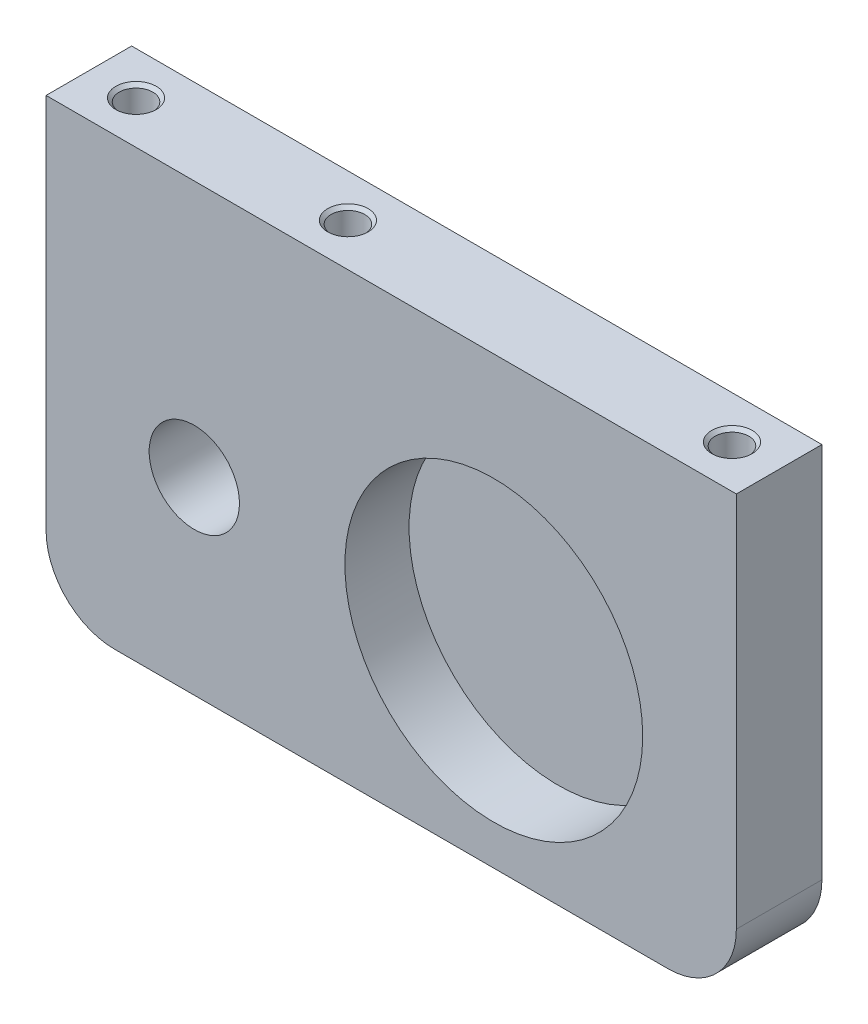
ISO-10303-21;
HEADER;
FILE_DESCRIPTION(('STEP AP214'),'2;1');
FILE_NAME('part.step','',(''),(''),'','','');
FILE_SCHEMA(('AUTOMOTIVE_DESIGN { 1 0 10303 214 1 1 1 1 }'));
ENDSEC;
DATA;
#1=APPLICATION_CONTEXT('core data for automotive mechanical design processes');
#2=APPLICATION_PROTOCOL_DEFINITION('international standard','automotive_design',2000,#1);
#3=PRODUCT_CONTEXT('',#1,'mechanical');
#4=PRODUCT('Part','Part','',(#3));
#5=PRODUCT_RELATED_PRODUCT_CATEGORY('part','',(#4));
#6=PRODUCT_DEFINITION_FORMATION('','',#4);
#7=PRODUCT_DEFINITION_CONTEXT('part definition',#1,'design');
#8=PRODUCT_DEFINITION('design','',#6,#7);
#9=PRODUCT_DEFINITION_SHAPE('','',#8);
#10=(LENGTH_UNIT() NAMED_UNIT(*) SI_UNIT(.MILLI.,.METRE.));
#11=(NAMED_UNIT(*) PLANE_ANGLE_UNIT() SI_UNIT($,.RADIAN.));
#12=(NAMED_UNIT(*) SI_UNIT($,.STERADIAN.) SOLID_ANGLE_UNIT());
#13=UNCERTAINTY_MEASURE_WITH_UNIT(LENGTH_MEASURE(1.E-05),#10,'distance_accuracy_value','');
#14=(GEOMETRIC_REPRESENTATION_CONTEXT(3) GLOBAL_UNCERTAINTY_ASSIGNED_CONTEXT((#13)) GLOBAL_UNIT_ASSIGNED_CONTEXT((#10,
#11,#12)) REPRESENTATION_CONTEXT('',''));
#15=CARTESIAN_POINT('',(0.,0.,0.));
#16=DIRECTION('',(0.,0.,1.));
#17=DIRECTION('',(1.,0.,0.));
#18=AXIS2_PLACEMENT_3D('',#15,#16,#17);
#19=CARTESIAN_POINT('',(-33.225,19.05,-6.35));
#20=DIRECTION('',(-1.,0.,0.));
#21=DIRECTION('',(0.,-1.,0.));
#22=AXIS2_PLACEMENT_3D('',#19,#20,#21);
#23=PLANE('',#22);
#24=DIRECTION('',(0.,-1.,0.));
#25=VECTOR('',#24,1.);
#26=CARTESIAN_POINT('',(-33.225,19.05,-6.35));
#27=LINE('',#26,#25);
#28=CARTESIAN_POINT('',(-33.225,19.05,-6.35));
#29=VERTEX_POINT('',#28);
#30=CARTESIAN_POINT('',(-33.225,-8.92,-6.35));
#31=VERTEX_POINT('',#30);
#32=EDGE_CURVE('E115',#29,#31,#27,.T.);
#33=ORIENTED_EDGE('',*,*,#32,.T.);
#34=DIRECTION('',(0.,0.,1.));
#35=VECTOR('',#34,1.);
#36=CARTESIAN_POINT('',(-33.225,-8.92,-6.35));
#37=LINE('',#36,#35);
#38=CARTESIAN_POINT('',(-33.225,-8.92,0.));
#39=VERTEX_POINT('',#38);
#40=EDGE_CURVE('E143',#31,#39,#37,.T.);
#41=ORIENTED_EDGE('',*,*,#40,.T.);
#42=DIRECTION('',(0.,-1.,0.));
#43=VECTOR('',#42,1.);
#44=CARTESIAN_POINT('',(-33.225,19.05,0.));
#45=LINE('',#44,#43);
#46=CARTESIAN_POINT('',(-33.225,19.05,0.));
#47=VERTEX_POINT('',#46);
#48=EDGE_CURVE('E119',#47,#39,#45,.T.);
#49=ORIENTED_EDGE('',*,*,#48,.F.);
#50=DIRECTION('',(0.,0.,1.));
#51=VECTOR('',#50,1.);
#52=CARTESIAN_POINT('',(-33.225,19.05,-6.35));
#53=LINE('',#52,#51);
#54=EDGE_CURVE('E112',#29,#47,#53,.T.);
#55=ORIENTED_EDGE('',*,*,#54,.F.);
#56=EDGE_LOOP('',(#33,#41,#49,#55));
#57=FACE_BOUND('',#56,.T.);
#58=ADVANCED_FACE('F42',(#57),#23,.T.);
#59=CARTESIAN_POINT('',(-33.225,19.05,-6.35));
#60=DIRECTION('',(0.,1.,0.));
#61=DIRECTION('',(0.,0.,1.));
#62=AXIS2_PLACEMENT_3D('',#59,#60,#61);
#63=PLANE('',#62);
#64=CARTESIAN_POINT('',(14.5000000000001,19.05,-3.175));
#65=DIRECTION('',(0.,1.,0.));
#66=DIRECTION('',(0.,0.,1.));
#67=AXIS2_PLACEMENT_3D('',#64,#65,#66);
#68=CIRCLE('',#67,1.49999999999981);
#69=CARTESIAN_POINT('',(14.5000000000001,19.05,-1.67500000000019));
#70=VERTEX_POINT('',#69);
#71=EDGE_CURVE('E157',#70,#70,#68,.F.);
#72=ORIENTED_EDGE('',*,*,#71,.T.);
#73=EDGE_LOOP('',(#72));
#74=FACE_BOUND('',#73,.T.);
#75=CARTESIAN_POINT('',(-14.,19.05,-3.175));
#76=DIRECTION('',(0.,1.,0.));
#77=DIRECTION('',(0.,0.,1.));
#78=AXIS2_PLACEMENT_3D('',#75,#76,#77);
#79=CIRCLE('',#78,1.49999999999922);
#80=CARTESIAN_POINT('',(-14.,19.05,-1.67500000000078));
#81=VERTEX_POINT('',#80);
#82=EDGE_CURVE('E153',#81,#81,#79,.F.);
#83=ORIENTED_EDGE('',*,*,#82,.T.);
#84=EDGE_LOOP('',(#83));
#85=FACE_BOUND('',#84,.T.);
#86=CARTESIAN_POINT('',(-29.725,19.05,-3.175));
#87=DIRECTION('',(0.,1.,0.));
#88=DIRECTION('',(0.,0.,1.));
#89=AXIS2_PLACEMENT_3D('',#86,#87,#88);
#90=CIRCLE('',#89,1.49999999999981);
#91=CARTESIAN_POINT('',(-29.725,19.05,-1.67500000000019));
#92=VERTEX_POINT('',#91);
#93=EDGE_CURVE('E149',#92,#92,#90,.F.);
#94=ORIENTED_EDGE('',*,*,#93,.T.);
#95=EDGE_LOOP('',(#94));
#96=FACE_BOUND('',#95,.T.);
#97=DIRECTION('',(-1.,0.,0.));
#98=VECTOR('',#97,1.);
#99=CARTESIAN_POINT('',(-33.225,19.05,0.));
#100=LINE('',#99,#98);
#101=CARTESIAN_POINT('',(18.,19.05,0.));
#102=VERTEX_POINT('',#101);
#103=EDGE_CURVE('E111',#102,#47,#100,.T.);
#104=ORIENTED_EDGE('',*,*,#103,.F.);
#105=DIRECTION('',(0.,0.,1.));
#106=VECTOR('',#105,1.);
#107=CARTESIAN_POINT('',(18.,19.05,-6.35));
#108=LINE('',#107,#106);
#109=CARTESIAN_POINT('',(18.,19.05,-6.35));
#110=VERTEX_POINT('',#109);
#111=EDGE_CURVE('E99',#110,#102,#108,.T.);
#112=ORIENTED_EDGE('',*,*,#111,.F.);
#113=DIRECTION('',(-1.,0.,0.));
#114=VECTOR('',#113,1.);
#115=CARTESIAN_POINT('',(-33.225,19.05,-6.35));
#116=LINE('',#115,#114);
#117=EDGE_CURVE('E104',#110,#29,#116,.T.);
#118=ORIENTED_EDGE('',*,*,#117,.T.);
#119=ORIENTED_EDGE('',*,*,#54,.T.);
#120=EDGE_LOOP('',(#104,#112,#118,#119));
#121=FACE_BOUND('',#120,.T.);
#122=ADVANCED_FACE('F109',(#74,#85,#96,#121),#63,.T.);
#123=CARTESIAN_POINT('',(18.,19.05,-6.35));
#124=DIRECTION('',(1.,0.,0.));
#125=DIRECTION('',(0.,1.,0.));
#126=AXIS2_PLACEMENT_3D('',#123,#124,#125);
#127=PLANE('',#126);
#128=DIRECTION('',(0.,1.,0.));
#129=VECTOR('',#128,1.);
#130=CARTESIAN_POINT('',(18.,19.05,0.));
#131=LINE('',#130,#129);
#132=CARTESIAN_POINT('',(18.,-8.92,0.));
#133=VERTEX_POINT('',#132);
#134=EDGE_CURVE('E126',#133,#102,#131,.T.);
#135=ORIENTED_EDGE('',*,*,#134,.F.);
#136=DIRECTION('',(0.,0.,1.));
#137=VECTOR('',#136,1.);
#138=CARTESIAN_POINT('',(18.,-8.92,-6.35));
#139=LINE('',#138,#137);
#140=CARTESIAN_POINT('',(18.,-8.92,-6.35));
#141=VERTEX_POINT('',#140);
#142=EDGE_CURVE('E65',#133,#141,#139,.F.);
#143=ORIENTED_EDGE('',*,*,#142,.T.);
#144=DIRECTION('',(0.,1.,0.));
#145=VECTOR('',#144,1.);
#146=CARTESIAN_POINT('',(18.,19.05,-6.35));
#147=LINE('',#146,#145);
#148=EDGE_CURVE('E96',#141,#110,#147,.T.);
#149=ORIENTED_EDGE('',*,*,#148,.T.);
#150=ORIENTED_EDGE('',*,*,#111,.T.);
#151=EDGE_LOOP('',(#135,#143,#149,#150));
#152=FACE_BOUND('',#151,.T.);
#153=ADVANCED_FACE('F98',(#152),#127,.T.);
#154=CARTESIAN_POINT('',(-33.225,-14.,-6.35));
#155=DIRECTION('',(0.,-1.,0.));
#156=DIRECTION('',(0.,0.,-1.));
#157=AXIS2_PLACEMENT_3D('',#154,#155,#156);
#158=PLANE('',#157);
#159=DIRECTION('',(1.,0.,0.));
#160=VECTOR('',#159,1.);
#161=CARTESIAN_POINT('',(-33.225,-14.,-6.35));
#162=LINE('',#161,#160);
#163=CARTESIAN_POINT('',(-28.145,-14.,-6.35));
#164=VERTEX_POINT('',#163);
#165=CARTESIAN_POINT('',(12.92,-14.,-6.35));
#166=VERTEX_POINT('',#165);
#167=EDGE_CURVE('E105',#164,#166,#162,.T.);
#168=ORIENTED_EDGE('',*,*,#167,.T.);
#169=DIRECTION('',(0.,0.,1.));
#170=VECTOR('',#169,1.);
#171=CARTESIAN_POINT('',(12.92,-14.,-6.35));
#172=LINE('',#171,#170);
#173=CARTESIAN_POINT('',(12.92,-14.,0.));
#174=VERTEX_POINT('',#173);
#175=EDGE_CURVE('E132',#166,#174,#172,.T.);
#176=ORIENTED_EDGE('',*,*,#175,.T.);
#177=DIRECTION('',(1.,0.,0.));
#178=VECTOR('',#177,1.);
#179=CARTESIAN_POINT('',(-33.225,-14.,0.));
#180=LINE('',#179,#178);
#181=CARTESIAN_POINT('',(-28.145,-14.,0.));
#182=VERTEX_POINT('',#181);
#183=EDGE_CURVE('E122',#182,#174,#180,.T.);
#184=ORIENTED_EDGE('',*,*,#183,.F.);
#185=DIRECTION('',(0.,0.,1.));
#186=VECTOR('',#185,1.);
#187=CARTESIAN_POINT('',(-28.145,-14.,-6.35));
#188=LINE('',#187,#186);
#189=EDGE_CURVE('E129',#182,#164,#188,.F.);
#190=ORIENTED_EDGE('',*,*,#189,.T.);
#191=EDGE_LOOP('',(#168,#176,#184,#190));
#192=FACE_BOUND('',#191,.T.);
#193=ADVANCED_FACE('F189',(#192),#158,.T.);
#194=CARTESIAN_POINT('',(0.,0.,-6.35));
#195=DIRECTION('',(0.,0.,1.));
#196=DIRECTION('',(1.,0.,0.));
#197=AXIS2_PLACEMENT_3D('',#194,#195,#196);
#198=PLANE('',#197);
#199=ORIENTED_EDGE('',*,*,#148,.F.);
#200=CARTESIAN_POINT('',(12.92,-8.92,-6.35));
#201=DIRECTION('',(0.,0.,1.));
#202=DIRECTION('',(1.,0.,0.));
#203=AXIS2_PLACEMENT_3D('',#200,#201,#202);
#204=CIRCLE('',#203,5.08);
#205=EDGE_CURVE('E141',#141,#166,#204,.F.);
#206=ORIENTED_EDGE('',*,*,#205,.T.);
#207=ORIENTED_EDGE('',*,*,#167,.F.);
#208=CARTESIAN_POINT('',(-28.145,-8.92,-6.35));
#209=DIRECTION('',(0.,0.,1.));
#210=DIRECTION('',(1.,0.,0.));
#211=AXIS2_PLACEMENT_3D('',#208,#209,#210);
#212=CIRCLE('',#211,5.08);
#213=EDGE_CURVE('E57',#164,#31,#212,.F.);
#214=ORIENTED_EDGE('',*,*,#213,.T.);
#215=ORIENTED_EDGE('',*,*,#32,.F.);
#216=ORIENTED_EDGE('',*,*,#117,.F.);
#217=EDGE_LOOP('',(#199,#206,#207,#214,#215,#216));
#218=FACE_BOUND('',#217,.T.);
#219=ADVANCED_FACE('F114',(#218),#198,.F.);
#220=CARTESIAN_POINT('',(0.,0.,0.));
#221=DIRECTION('',(0.,0.,1.));
#222=DIRECTION('',(1.,0.,0.));
#223=AXIS2_PLACEMENT_3D('',#220,#221,#222);
#224=PLANE('',#223);
#225=CARTESIAN_POINT('',(-22.225,0.,0.));
#226=DIRECTION('',(0.,0.,1.));
#227=DIRECTION('',(1.,0.,0.));
#228=AXIS2_PLACEMENT_3D('',#225,#226,#227);
#229=CIRCLE('',#228,3.35);
#230=CARTESIAN_POINT('',(-18.875,0.,0.));
#231=VERTEX_POINT('',#230);
#232=EDGE_CURVE('E224',#231,#231,#229,.T.);
#233=ORIENTED_EDGE('',*,*,#232,.F.);
#234=EDGE_LOOP('',(#233));
#235=FACE_BOUND('',#234,.T.);
#236=CARTESIAN_POINT('',(0.,0.,0.));
#237=DIRECTION('',(0.,0.,1.));
#238=DIRECTION('',(1.,0.,0.));
#239=AXIS2_PLACEMENT_3D('',#236,#237,#238);
#240=CIRCLE('',#239,11.05);
#241=CARTESIAN_POINT('',(11.05,0.,0.));
#242=VERTEX_POINT('',#241);
#243=EDGE_CURVE('E225',#242,#242,#240,.T.);
#244=ORIENTED_EDGE('',*,*,#243,.F.);
#245=EDGE_LOOP('',(#244));
#246=FACE_BOUND('',#245,.T.);
#247=ORIENTED_EDGE('',*,*,#183,.T.);
#248=CARTESIAN_POINT('',(12.92,-8.92,0.));
#249=DIRECTION('',(0.,0.,1.));
#250=DIRECTION('',(1.,0.,0.));
#251=AXIS2_PLACEMENT_3D('',#248,#249,#250);
#252=CIRCLE('',#251,5.08);
#253=EDGE_CURVE('E137',#174,#133,#252,.T.);
#254=ORIENTED_EDGE('',*,*,#253,.T.);
#255=ORIENTED_EDGE('',*,*,#134,.T.);
#256=ORIENTED_EDGE('',*,*,#103,.T.);
#257=ORIENTED_EDGE('',*,*,#48,.T.);
#258=CARTESIAN_POINT('',(-28.145,-8.92,0.));
#259=DIRECTION('',(0.,0.,1.));
#260=DIRECTION('',(1.,0.,0.));
#261=AXIS2_PLACEMENT_3D('',#258,#259,#260);
#262=CIRCLE('',#261,5.08);
#263=EDGE_CURVE('E135',#39,#182,#262,.T.);
#264=ORIENTED_EDGE('',*,*,#263,.T.);
#265=EDGE_LOOP('',(#247,#254,#255,#256,#257,#264));
#266=FACE_BOUND('',#265,.T.);
#267=ADVANCED_FACE('F204',(#235,#246,#266),#224,.T.);
#268=CARTESIAN_POINT('',(14.5000000000001,4.05,-3.175));
#269=DIRECTION('',(0.,1.,0.));
#270=DIRECTION('',(0.,0.,1.));
#271=AXIS2_PLACEMENT_3D('',#268,#269,#270);
#272=CYLINDRICAL_SURFACE('',#271,1.2499999999998);
#273=CARTESIAN_POINT('',(14.5000000000001,18.8,-3.175));
#274=DIRECTION('',(0.,1.,0.));
#275=DIRECTION('',(0.,0.,1.));
#276=AXIS2_PLACEMENT_3D('',#273,#274,#275);
#277=CIRCLE('',#276,1.2499999999998);
#278=CARTESIAN_POINT('',(14.5000000000001,18.8,-1.9250000000002));
#279=VERTEX_POINT('',#278);
#280=EDGE_CURVE('E146',#279,#279,#277,.T.);
#281=ORIENTED_EDGE('',*,*,#280,.T.);
#282=EDGE_LOOP('',(#281));
#283=FACE_BOUND('',#282,.T.);
#284=CARTESIAN_POINT('',(14.5000000000001,4.05,-3.175));
#285=DIRECTION('',(0.,1.,0.));
#286=DIRECTION('',(0.,0.,1.));
#287=AXIS2_PLACEMENT_3D('',#284,#285,#286);
#288=CIRCLE('',#287,1.2499999999998);
#289=CARTESIAN_POINT('',(14.5000000000001,4.05,-1.9250000000002));
#290=VERTEX_POINT('',#289);
#291=EDGE_CURVE('E211',#290,#290,#288,.T.);
#292=ORIENTED_EDGE('',*,*,#291,.F.);
#293=EDGE_LOOP('',(#292));
#294=FACE_BOUND('',#293,.T.);
#295=ADVANCED_FACE('F238',(#283,#294),#272,.F.);
#296=CARTESIAN_POINT('',(14.5000000000001,4.05,-3.175));
#297=DIRECTION('',(0.,1.,0.));
#298=DIRECTION('',(0.,0.,1.));
#299=AXIS2_PLACEMENT_3D('',#296,#297,#298);
#300=PLANE('',#299);
#301=ORIENTED_EDGE('',*,*,#291,.T.);
#302=EDGE_LOOP('',(#301));
#303=FACE_BOUND('',#302,.T.);
#304=ADVANCED_FACE('F268',(#303),#300,.T.);
#305=CARTESIAN_POINT('',(-14.,4.05,-3.175));
#306=DIRECTION('',(0.,1.,0.));
#307=DIRECTION('',(0.,0.,1.));
#308=AXIS2_PLACEMENT_3D('',#305,#306,#307);
#309=CYLINDRICAL_SURFACE('',#308,1.24999999999922);
#310=CARTESIAN_POINT('',(-14.,18.8,-3.175));
#311=DIRECTION('',(0.,1.,0.));
#312=DIRECTION('',(0.,0.,1.));
#313=AXIS2_PLACEMENT_3D('',#310,#311,#312);
#314=CIRCLE('',#313,1.24999999999922);
#315=CARTESIAN_POINT('',(-14.,18.8,-1.92500000000078));
#316=VERTEX_POINT('',#315);
#317=EDGE_CURVE('E50',#316,#316,#314,.T.);
#318=ORIENTED_EDGE('',*,*,#317,.T.);
#319=EDGE_LOOP('',(#318));
#320=FACE_BOUND('',#319,.T.);
#321=CARTESIAN_POINT('',(-14.,4.05,-3.175));
#322=DIRECTION('',(0.,1.,0.));
#323=DIRECTION('',(0.,0.,1.));
#324=AXIS2_PLACEMENT_3D('',#321,#322,#323);
#325=CIRCLE('',#324,1.24999999999922);
#326=CARTESIAN_POINT('',(-14.,4.05,-1.92500000000078));
#327=VERTEX_POINT('',#326);
#328=EDGE_CURVE('E214',#327,#327,#325,.T.);
#329=ORIENTED_EDGE('',*,*,#328,.F.);
#330=EDGE_LOOP('',(#329));
#331=FACE_BOUND('',#330,.T.);
#332=ADVANCED_FACE('F163',(#320,#331),#309,.F.);
#333=CARTESIAN_POINT('',(-14.,4.05,-3.175));
#334=DIRECTION('',(0.,1.,0.));
#335=DIRECTION('',(0.,0.,1.));
#336=AXIS2_PLACEMENT_3D('',#333,#334,#335);
#337=PLANE('',#336);
#338=ORIENTED_EDGE('',*,*,#328,.T.);
#339=EDGE_LOOP('',(#338));
#340=FACE_BOUND('',#339,.T.);
#341=ADVANCED_FACE('F261',(#340),#337,.T.);
#342=CARTESIAN_POINT('',(-29.725,4.05,-3.175));
#343=DIRECTION('',(0.,1.,0.));
#344=DIRECTION('',(0.,0.,1.));
#345=AXIS2_PLACEMENT_3D('',#342,#343,#344);
#346=CYLINDRICAL_SURFACE('',#345,1.2499999999998);
#347=CARTESIAN_POINT('',(-29.725,18.8,-3.175));
#348=DIRECTION('',(0.,1.,0.));
#349=DIRECTION('',(0.,0.,1.));
#350=AXIS2_PLACEMENT_3D('',#347,#348,#349);
#351=CIRCLE('',#350,1.2499999999998);
#352=CARTESIAN_POINT('',(-29.725,18.8,-1.9250000000002));
#353=VERTEX_POINT('',#352);
#354=EDGE_CURVE('E12',#353,#353,#351,.T.);
#355=ORIENTED_EDGE('',*,*,#354,.T.);
#356=EDGE_LOOP('',(#355));
#357=FACE_BOUND('',#356,.T.);
#358=CARTESIAN_POINT('',(-29.725,4.05,-3.175));
#359=DIRECTION('',(0.,1.,0.));
#360=DIRECTION('',(0.,0.,1.));
#361=AXIS2_PLACEMENT_3D('',#358,#359,#360);
#362=CIRCLE('',#361,1.2499999999998);
#363=CARTESIAN_POINT('',(-29.725,4.05,-1.9250000000002));
#364=VERTEX_POINT('',#363);
#365=EDGE_CURVE('E123',#364,#364,#362,.T.);
#366=ORIENTED_EDGE('',*,*,#365,.F.);
#367=EDGE_LOOP('',(#366));
#368=FACE_BOUND('',#367,.T.);
#369=ADVANCED_FACE('F254',(#357,#368),#346,.F.);
#370=CARTESIAN_POINT('',(-29.725,4.05,-3.175));
#371=DIRECTION('',(0.,1.,0.));
#372=DIRECTION('',(0.,0.,1.));
#373=AXIS2_PLACEMENT_3D('',#370,#371,#372);
#374=PLANE('',#373);
#375=ORIENTED_EDGE('',*,*,#365,.T.);
#376=EDGE_LOOP('',(#375));
#377=FACE_BOUND('',#376,.T.);
#378=ADVANCED_FACE('F245',(#377),#374,.T.);
#379=CARTESIAN_POINT('',(0.,0.,-37.6041197284454));
#380=DIRECTION('',(0.,0.,1.));
#381=DIRECTION('',(1.,0.,0.));
#382=AXIS2_PLACEMENT_3D('',#379,#380,#381);
#383=CYLINDRICAL_SURFACE('',#382,11.05);
#384=CARTESIAN_POINT('',(0.,0.,-4.7625));
#385=DIRECTION('',(0.,0.,1.));
#386=DIRECTION('',(1.,0.,0.));
#387=AXIS2_PLACEMENT_3D('',#384,#385,#386);
#388=CIRCLE('',#387,11.05);
#389=CARTESIAN_POINT('',(11.05,0.,-4.7625));
#390=VERTEX_POINT('',#389);
#391=EDGE_CURVE('E220',#390,#390,#388,.F.);
#392=ORIENTED_EDGE('',*,*,#391,.T.);
#393=EDGE_LOOP('',(#392));
#394=FACE_BOUND('',#393,.T.);
#395=ORIENTED_EDGE('',*,*,#243,.T.);
#396=EDGE_LOOP('',(#395));
#397=FACE_BOUND('',#396,.T.);
#398=ADVANCED_FACE('F242',(#394,#397),#383,.F.);
#399=CARTESIAN_POINT('',(0.,0.,-4.7625));
#400=DIRECTION('',(0.,0.,1.));
#401=DIRECTION('',(1.,0.,0.));
#402=AXIS2_PLACEMENT_3D('',#399,#400,#401);
#403=PLANE('',#402);
#404=ORIENTED_EDGE('',*,*,#391,.F.);
#405=EDGE_LOOP('',(#404));
#406=FACE_BOUND('',#405,.T.);
#407=ADVANCED_FACE('F244',(#406),#403,.T.);
#408=CARTESIAN_POINT('',(-22.225,0.,-37.6041197284454));
#409=DIRECTION('',(0.,0.,1.));
#410=DIRECTION('',(1.,0.,0.));
#411=AXIS2_PLACEMENT_3D('',#408,#409,#410);
#412=CYLINDRICAL_SURFACE('',#411,3.35);
#413=CARTESIAN_POINT('',(-22.225,0.,-4.7625));
#414=DIRECTION('',(0.,0.,1.));
#415=DIRECTION('',(1.,0.,0.));
#416=AXIS2_PLACEMENT_3D('',#413,#414,#415);
#417=CIRCLE('',#416,3.35);
#418=CARTESIAN_POINT('',(-18.875,0.,-4.7625));
#419=VERTEX_POINT('',#418);
#420=EDGE_CURVE('E215',#419,#419,#417,.F.);
#421=ORIENTED_EDGE('',*,*,#420,.T.);
#422=EDGE_LOOP('',(#421));
#423=FACE_BOUND('',#422,.T.);
#424=ORIENTED_EDGE('',*,*,#232,.T.);
#425=EDGE_LOOP('',(#424));
#426=FACE_BOUND('',#425,.T.);
#427=ADVANCED_FACE('F234',(#423,#426),#412,.F.);
#428=CARTESIAN_POINT('',(0.,0.,-4.7625));
#429=DIRECTION('',(0.,0.,1.));
#430=DIRECTION('',(1.,0.,0.));
#431=AXIS2_PLACEMENT_3D('',#428,#429,#430);
#432=PLANE('',#431);
#433=ORIENTED_EDGE('',*,*,#420,.F.);
#434=EDGE_LOOP('',(#433));
#435=FACE_BOUND('',#434,.T.);
#436=ADVANCED_FACE('F194',(#435),#432,.T.);
#437=CARTESIAN_POINT('',(12.92,-8.92,-6.35));
#438=DIRECTION('',(0.,0.,1.));
#439=DIRECTION('',(1.,0.,0.));
#440=AXIS2_PLACEMENT_3D('',#437,#438,#439);
#441=CYLINDRICAL_SURFACE('',#440,5.08);
#442=ORIENTED_EDGE('',*,*,#205,.F.);
#443=ORIENTED_EDGE('',*,*,#142,.F.);
#444=ORIENTED_EDGE('',*,*,#253,.F.);
#445=ORIENTED_EDGE('',*,*,#175,.F.);
#446=EDGE_LOOP('',(#442,#443,#444,#445));
#447=FACE_BOUND('',#446,.T.);
#448=ADVANCED_FACE('F191',(#447),#441,.T.);
#449=CARTESIAN_POINT('',(-28.145,-8.92,-6.35));
#450=DIRECTION('',(0.,0.,1.));
#451=DIRECTION('',(1.,0.,0.));
#452=AXIS2_PLACEMENT_3D('',#449,#450,#451);
#453=CYLINDRICAL_SURFACE('',#452,5.08);
#454=ORIENTED_EDGE('',*,*,#213,.F.);
#455=ORIENTED_EDGE('',*,*,#189,.F.);
#456=ORIENTED_EDGE('',*,*,#263,.F.);
#457=ORIENTED_EDGE('',*,*,#40,.F.);
#458=EDGE_LOOP('',(#454,#455,#456,#457));
#459=FACE_BOUND('',#458,.T.);
#460=ADVANCED_FACE('F175',(#459),#453,.T.);
#461=CARTESIAN_POINT('',(14.5000000000001,18.8,-3.175));
#462=DIRECTION('',(0.,1.,0.));
#463=DIRECTION('',(0.,0.,1.));
#464=AXIS2_PLACEMENT_3D('',#461,#462,#463);
#465=CONICAL_SURFACE('',#464,1.2499999999998,0.785398163397446);
#466=ORIENTED_EDGE('',*,*,#71,.F.);
#467=EDGE_LOOP('',(#466));
#468=FACE_BOUND('',#467,.T.);
#469=ORIENTED_EDGE('',*,*,#280,.F.);
#470=EDGE_LOOP('',(#469));
#471=FACE_BOUND('',#470,.T.);
#472=ADVANCED_FACE('F168',(#468,#471),#465,.F.);
#473=CARTESIAN_POINT('',(-14.,18.8,-3.175));
#474=DIRECTION('',(0.,1.,0.));
#475=DIRECTION('',(0.,0.,1.));
#476=AXIS2_PLACEMENT_3D('',#473,#474,#475);
#477=CONICAL_SURFACE('',#476,1.24999999999922,0.785398163397456);
#478=ORIENTED_EDGE('',*,*,#82,.F.);
#479=EDGE_LOOP('',(#478));
#480=FACE_BOUND('',#479,.T.);
#481=ORIENTED_EDGE('',*,*,#317,.F.);
#482=EDGE_LOOP('',(#481));
#483=FACE_BOUND('',#482,.T.);
#484=ADVANCED_FACE('F166',(#480,#483),#477,.F.);
#485=CARTESIAN_POINT('',(-29.725,18.8,-3.175));
#486=DIRECTION('',(0.,1.,0.));
#487=DIRECTION('',(0.,0.,1.));
#488=AXIS2_PLACEMENT_3D('',#485,#486,#487);
#489=CONICAL_SURFACE('',#488,1.2499999999998,0.785398163397459);
#490=ORIENTED_EDGE('',*,*,#93,.F.);
#491=EDGE_LOOP('',(#490));
#492=FACE_BOUND('',#491,.T.);
#493=ORIENTED_EDGE('',*,*,#354,.F.);
#494=EDGE_LOOP('',(#493));
#495=FACE_BOUND('',#494,.T.);
#496=ADVANCED_FACE('F44',(#492,#495),#489,.F.);
#497=CLOSED_SHELL('',(#58,#122,#153,#193,#219,#267,#295,#304,#332,#341,#369,#378,#398,#407,#427,
#436,#448,#460,#472,#484,#496));
#498=MANIFOLD_SOLID_BREP('B2',#497);
#499=ADVANCED_BREP_SHAPE_REPRESENTATION('',(#18,#498),#14);
#500=SHAPE_DEFINITION_REPRESENTATION(#9,#499);
ENDSEC;
END-ISO-10303-21;
